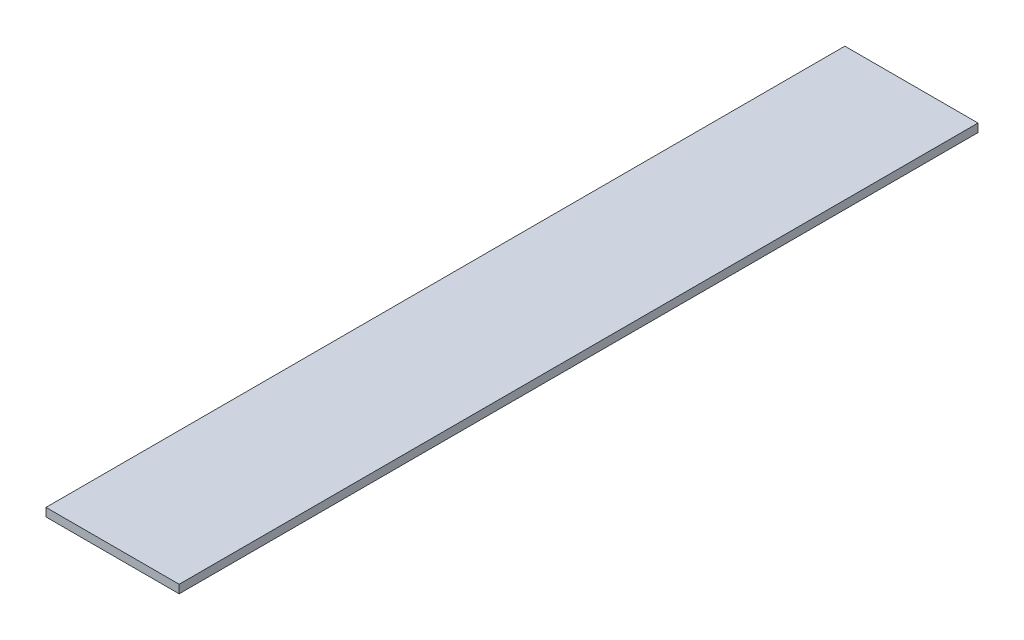
ISO-10303-21;
HEADER;
FILE_DESCRIPTION(('STEP AP214'),'2;1');
FILE_NAME('part.step','',(''),(''),'','','');
FILE_SCHEMA(('AUTOMOTIVE_DESIGN { 1 0 10303 214 1 1 1 1 }'));
ENDSEC;
DATA;
#1=APPLICATION_CONTEXT('core data for automotive mechanical design processes');
#2=APPLICATION_PROTOCOL_DEFINITION('international standard','automotive_design',2000,#1);
#3=PRODUCT_CONTEXT('',#1,'mechanical');
#4=PRODUCT('Part','Part','',(#3));
#5=PRODUCT_RELATED_PRODUCT_CATEGORY('part','',(#4));
#6=PRODUCT_DEFINITION_FORMATION('','',#4);
#7=PRODUCT_DEFINITION_CONTEXT('part definition',#1,'design');
#8=PRODUCT_DEFINITION('design','',#6,#7);
#9=PRODUCT_DEFINITION_SHAPE('','',#8);
#10=(LENGTH_UNIT() NAMED_UNIT(*) SI_UNIT(.MILLI.,.METRE.));
#11=(NAMED_UNIT(*) PLANE_ANGLE_UNIT() SI_UNIT($,.RADIAN.));
#12=(NAMED_UNIT(*) SI_UNIT($,.STERADIAN.) SOLID_ANGLE_UNIT());
#13=UNCERTAINTY_MEASURE_WITH_UNIT(LENGTH_MEASURE(1.E-05),#10,'distance_accuracy_value','');
#14=(GEOMETRIC_REPRESENTATION_CONTEXT(3) GLOBAL_UNCERTAINTY_ASSIGNED_CONTEXT((#13)) GLOBAL_UNIT_ASSIGNED_CONTEXT((#10,
#11,#12)) REPRESENTATION_CONTEXT('',''));
#15=CARTESIAN_POINT('',(0.,0.,0.));
#16=DIRECTION('',(0.,0.,1.));
#17=DIRECTION('',(1.,0.,0.));
#18=AXIS2_PLACEMENT_3D('',#15,#16,#17);
#19=CARTESIAN_POINT('',(25.4,1.5875,304.8));
#20=DIRECTION('',(-1.,0.,0.));
#21=DIRECTION('',(0.,0.,1.));
#22=AXIS2_PLACEMENT_3D('',#19,#20,#21);
#23=PLANE('',#22);
#24=DIRECTION('',(0.,1.,0.));
#25=VECTOR('',#24,1.);
#26=CARTESIAN_POINT('',(25.4,1.5875,0.));
#27=LINE('',#26,#25);
#28=CARTESIAN_POINT('',(25.4,-1.5875,0.));
#29=VERTEX_POINT('',#28);
#30=CARTESIAN_POINT('',(25.4,1.5875,0.));
#31=VERTEX_POINT('',#30);
#32=EDGE_CURVE('E107',#29,#31,#27,.T.);
#33=ORIENTED_EDGE('',*,*,#32,.T.);
#34=DIRECTION('',(0.,0.,-1.));
#35=VECTOR('',#34,1.);
#36=CARTESIAN_POINT('',(25.4,1.5875,304.8));
#37=LINE('',#36,#35);
#38=CARTESIAN_POINT('',(25.4,1.5875,304.8));
#39=VERTEX_POINT('',#38);
#40=EDGE_CURVE('E11',#39,#31,#37,.T.);
#41=ORIENTED_EDGE('',*,*,#40,.F.);
#42=DIRECTION('',(0.,1.,0.));
#43=VECTOR('',#42,1.);
#44=CARTESIAN_POINT('',(25.4,1.5875,304.8));
#45=LINE('',#44,#43);
#46=CARTESIAN_POINT('',(25.4,-1.5875,304.8));
#47=VERTEX_POINT('',#46);
#48=EDGE_CURVE('E91',#47,#39,#45,.T.);
#49=ORIENTED_EDGE('',*,*,#48,.F.);
#50=DIRECTION('',(0.,0.,-1.));
#51=VECTOR('',#50,1.);
#52=CARTESIAN_POINT('',(25.4,-1.5875,304.8));
#53=LINE('',#52,#51);
#54=EDGE_CURVE('E103',#47,#29,#53,.T.);
#55=ORIENTED_EDGE('',*,*,#54,.T.);
#56=EDGE_LOOP('',(#33,#41,#49,#55));
#57=FACE_BOUND('',#56,.T.);
#58=ADVANCED_FACE('F39',(#57),#23,.F.);
#59=CARTESIAN_POINT('',(-25.4,1.5875,304.8));
#60=DIRECTION('',(0.,-1.,0.));
#61=DIRECTION('',(0.,0.,-1.));
#62=AXIS2_PLACEMENT_3D('',#59,#60,#61);
#63=PLANE('',#62);
#64=DIRECTION('',(-1.,0.,0.));
#65=VECTOR('',#64,1.);
#66=CARTESIAN_POINT('',(-25.4,1.5875,0.));
#67=LINE('',#66,#65);
#68=CARTESIAN_POINT('',(-25.4,1.5875,0.));
#69=VERTEX_POINT('',#68);
#70=EDGE_CURVE('E96',#31,#69,#67,.T.);
#71=ORIENTED_EDGE('',*,*,#70,.T.);
#72=DIRECTION('',(0.,0.,-1.));
#73=VECTOR('',#72,1.);
#74=CARTESIAN_POINT('',(-25.4,1.5875,304.8));
#75=LINE('',#74,#73);
#76=CARTESIAN_POINT('',(-25.4,1.5875,304.8));
#77=VERTEX_POINT('',#76);
#78=EDGE_CURVE('E48',#77,#69,#75,.T.);
#79=ORIENTED_EDGE('',*,*,#78,.F.);
#80=DIRECTION('',(-1.,0.,0.));
#81=VECTOR('',#80,1.);
#82=CARTESIAN_POINT('',(-25.4,1.5875,304.8));
#83=LINE('',#82,#81);
#84=EDGE_CURVE('E86',#39,#77,#83,.T.);
#85=ORIENTED_EDGE('',*,*,#84,.F.);
#86=ORIENTED_EDGE('',*,*,#40,.T.);
#87=EDGE_LOOP('',(#71,#79,#85,#86));
#88=FACE_BOUND('',#87,.T.);
#89=ADVANCED_FACE('F95',(#88),#63,.F.);
#90=CARTESIAN_POINT('',(-25.4,1.5875,304.8));
#91=DIRECTION('',(1.,0.,0.));
#92=DIRECTION('',(0.,0.,-1.));
#93=AXIS2_PLACEMENT_3D('',#90,#91,#92);
#94=PLANE('',#93);
#95=DIRECTION('',(0.,-1.,0.));
#96=VECTOR('',#95,1.);
#97=CARTESIAN_POINT('',(-25.4,1.5875,0.));
#98=LINE('',#97,#96);
#99=CARTESIAN_POINT('',(-25.4,-1.5875,0.));
#100=VERTEX_POINT('',#99);
#101=EDGE_CURVE('E73',#69,#100,#98,.T.);
#102=ORIENTED_EDGE('',*,*,#101,.T.);
#103=DIRECTION('',(0.,0.,-1.));
#104=VECTOR('',#103,1.);
#105=CARTESIAN_POINT('',(-25.4,-1.5875,304.8));
#106=LINE('',#105,#104);
#107=CARTESIAN_POINT('',(-25.4,-1.5875,304.8));
#108=VERTEX_POINT('',#107);
#109=EDGE_CURVE('E98',#108,#100,#106,.T.);
#110=ORIENTED_EDGE('',*,*,#109,.F.);
#111=DIRECTION('',(0.,-1.,0.));
#112=VECTOR('',#111,1.);
#113=CARTESIAN_POINT('',(-25.4,1.5875,304.8));
#114=LINE('',#113,#112);
#115=EDGE_CURVE('E89',#77,#108,#114,.T.);
#116=ORIENTED_EDGE('',*,*,#115,.F.);
#117=ORIENTED_EDGE('',*,*,#78,.T.);
#118=EDGE_LOOP('',(#102,#110,#116,#117));
#119=FACE_BOUND('',#118,.T.);
#120=ADVANCED_FACE('F99',(#119),#94,.F.);
#121=CARTESIAN_POINT('',(-25.4,-1.5875,304.8));
#122=DIRECTION('',(0.,1.,0.));
#123=DIRECTION('',(0.,0.,1.));
#124=AXIS2_PLACEMENT_3D('',#121,#122,#123);
#125=PLANE('',#124);
#126=DIRECTION('',(1.,0.,0.));
#127=VECTOR('',#126,1.);
#128=CARTESIAN_POINT('',(-25.4,-1.5875,0.));
#129=LINE('',#128,#127);
#130=EDGE_CURVE('E79',#100,#29,#129,.T.);
#131=ORIENTED_EDGE('',*,*,#130,.T.);
#132=ORIENTED_EDGE('',*,*,#54,.F.);
#133=DIRECTION('',(1.,0.,0.));
#134=VECTOR('',#133,1.);
#135=CARTESIAN_POINT('',(-25.4,-1.5875,304.8));
#136=LINE('',#135,#134);
#137=EDGE_CURVE('E56',#108,#47,#136,.T.);
#138=ORIENTED_EDGE('',*,*,#137,.F.);
#139=ORIENTED_EDGE('',*,*,#109,.T.);
#140=EDGE_LOOP('',(#131,#132,#138,#139));
#141=FACE_BOUND('',#140,.T.);
#142=ADVANCED_FACE('F120',(#141),#125,.F.);
#143=CARTESIAN_POINT('',(0.,0.,304.8));
#144=DIRECTION('',(0.,0.,1.));
#145=DIRECTION('',(1.,0.,0.));
#146=AXIS2_PLACEMENT_3D('',#143,#144,#145);
#147=PLANE('',#146);
#148=ORIENTED_EDGE('',*,*,#48,.T.);
#149=ORIENTED_EDGE('',*,*,#84,.T.);
#150=ORIENTED_EDGE('',*,*,#115,.T.);
#151=ORIENTED_EDGE('',*,*,#137,.T.);
#152=EDGE_LOOP('',(#148,#149,#150,#151));
#153=FACE_BOUND('',#152,.T.);
#154=ADVANCED_FACE('F87',(#153),#147,.T.);
#155=CARTESIAN_POINT('',(0.,0.,0.));
#156=DIRECTION('',(0.,0.,1.));
#157=DIRECTION('',(1.,0.,0.));
#158=AXIS2_PLACEMENT_3D('',#155,#156,#157);
#159=PLANE('',#158);
#160=ORIENTED_EDGE('',*,*,#32,.F.);
#161=ORIENTED_EDGE('',*,*,#130,.F.);
#162=ORIENTED_EDGE('',*,*,#101,.F.);
#163=ORIENTED_EDGE('',*,*,#70,.F.);
#164=EDGE_LOOP('',(#160,#161,#162,#163));
#165=FACE_BOUND('',#164,.T.);
#166=ADVANCED_FACE('F123',(#165),#159,.F.);
#167=CLOSED_SHELL('',(#58,#89,#120,#142,#154,#166));
#168=MANIFOLD_SOLID_BREP('B2',#167);
#169=ADVANCED_BREP_SHAPE_REPRESENTATION('',(#18,#168),#14);
#170=SHAPE_DEFINITION_REPRESENTATION(#9,#169);
ENDSEC;
END-ISO-10303-21;
